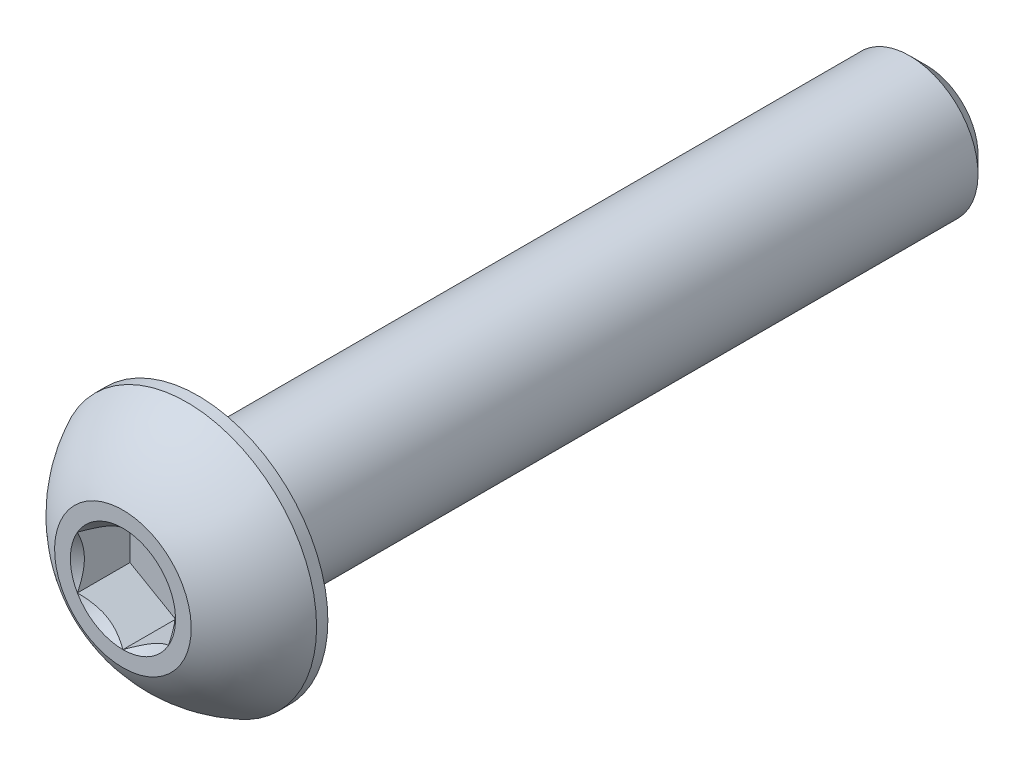
ISO-10303-21;
HEADER;
FILE_DESCRIPTION(('STEP AP214'),'2;1');
FILE_NAME('part.step','',(''),(''),'','','');
FILE_SCHEMA(('AUTOMOTIVE_DESIGN { 1 0 10303 214 1 1 1 1 }'));
ENDSEC;
DATA;
#1=APPLICATION_CONTEXT('core data for automotive mechanical design processes');
#2=APPLICATION_PROTOCOL_DEFINITION('international standard','automotive_design',2000,#1);
#3=PRODUCT_CONTEXT('',#1,'mechanical');
#4=PRODUCT('Part','Part','',(#3));
#5=PRODUCT_RELATED_PRODUCT_CATEGORY('part','',(#4));
#6=PRODUCT_DEFINITION_FORMATION('','',#4);
#7=PRODUCT_DEFINITION_CONTEXT('part definition',#1,'design');
#8=PRODUCT_DEFINITION('design','',#6,#7);
#9=PRODUCT_DEFINITION_SHAPE('','',#8);
#10=(LENGTH_UNIT() NAMED_UNIT(*) SI_UNIT(.MILLI.,.METRE.));
#11=(NAMED_UNIT(*) PLANE_ANGLE_UNIT() SI_UNIT($,.RADIAN.));
#12=(NAMED_UNIT(*) SI_UNIT($,.STERADIAN.) SOLID_ANGLE_UNIT());
#13=UNCERTAINTY_MEASURE_WITH_UNIT(LENGTH_MEASURE(1.E-05),#10,'distance_accuracy_value','');
#14=(GEOMETRIC_REPRESENTATION_CONTEXT(3) GLOBAL_UNCERTAINTY_ASSIGNED_CONTEXT((#13)) GLOBAL_UNIT_ASSIGNED_CONTEXT((#10,
#11,#12)) REPRESENTATION_CONTEXT('',''));
#15=CARTESIAN_POINT('',(0.,0.,0.));
#16=DIRECTION('',(0.,0.,1.));
#17=DIRECTION('',(1.,0.,0.));
#18=AXIS2_PLACEMENT_3D('',#15,#16,#17);
#19=CARTESIAN_POINT('',(0.,-1.5,-17.65));
#20=DIRECTION('',(0.,0.,-1.));
#21=DIRECTION('',(0.,1.,0.));
#22=AXIS2_PLACEMENT_3D('',#19,#20,#21);
#23=PLANE('',#22);
#24=CARTESIAN_POINT('',(0.,0.,-17.65));
#25=DIRECTION('',(0.,0.,-1.));
#26=DIRECTION('',(0.,1.,0.));
#27=AXIS2_PLACEMENT_3D('',#24,#25,#26);
#28=CIRCLE('',#27,1.125);
#29=CARTESIAN_POINT('',(0.,1.125,-17.65));
#30=VERTEX_POINT('',#29);
#31=EDGE_CURVE('E174',#30,#30,#28,.T.);
#32=ORIENTED_EDGE('',*,*,#31,.T.);
#33=EDGE_LOOP('',(#32));
#34=FACE_BOUND('',#33,.T.);
#35=ADVANCED_FACE('F34',(#34),#23,.T.);
#36=CARTESIAN_POINT('',(0.,0.,-17.65));
#37=DIRECTION('',(0.,0.,-1.));
#38=DIRECTION('',(0.,1.,0.));
#39=AXIS2_PLACEMENT_3D('',#36,#37,#38);
#40=CYLINDRICAL_SURFACE('',#39,1.5);
#41=CARTESIAN_POINT('',(0.,0.,-17.275));
#42=DIRECTION('',(0.,0.,-1.));
#43=DIRECTION('',(0.,1.,0.));
#44=AXIS2_PLACEMENT_3D('',#41,#42,#43);
#45=CIRCLE('',#44,1.5);
#46=CARTESIAN_POINT('',(0.,1.5,-17.275));
#47=VERTEX_POINT('',#46);
#48=EDGE_CURVE('E48',#47,#47,#45,.F.);
#49=ORIENTED_EDGE('',*,*,#48,.T.);
#50=EDGE_LOOP('',(#49));
#51=FACE_BOUND('',#50,.T.);
#52=CARTESIAN_POINT('',(0.,0.,-1.65));
#53=DIRECTION('',(0.,0.,1.));
#54=DIRECTION('',(1.,0.,0.));
#55=AXIS2_PLACEMENT_3D('',#52,#53,#54);
#56=CIRCLE('',#55,1.5);
#57=CARTESIAN_POINT('',(1.5,0.,-1.65));
#58=VERTEX_POINT('',#57);
#59=EDGE_CURVE('E171',#58,#58,#56,.F.);
#60=ORIENTED_EDGE('',*,*,#59,.T.);
#61=EDGE_LOOP('',(#60));
#62=FACE_BOUND('',#61,.T.);
#63=ADVANCED_FACE('F179',(#51,#62),#40,.T.);
#64=CARTESIAN_POINT('',(0.,0.,-17.65));
#65=DIRECTION('',(0.,0.,1.));
#66=DIRECTION('',(0.,-1.,0.));
#67=AXIS2_PLACEMENT_3D('',#64,#65,#66);
#68=CONICAL_SURFACE('',#67,1.125,0.785398163397447);
#69=ORIENTED_EDGE('',*,*,#48,.F.);
#70=EDGE_LOOP('',(#69));
#71=FACE_BOUND('',#70,.T.);
#72=ORIENTED_EDGE('',*,*,#31,.F.);
#73=EDGE_LOOP('',(#72));
#74=FACE_BOUND('',#73,.T.);
#75=ADVANCED_FACE('F36',(#71,#74),#68,.T.);
#76=CARTESIAN_POINT('',(0.,0.,-2.79483288770053));
#77=DIRECTION('',(0.,0.,1.));
#78=DIRECTION('',(0.,-1.,0.));
#79=AXIS2_PLACEMENT_3D('',#76,#77,#78);
#80=SPHERICAL_SURFACE('',#79,3.17192226735973);
#81=CARTESIAN_POINT('',(0.,0.,0.));
#82=DIRECTION('',(0.,0.,1.));
#83=DIRECTION('',(1.,0.,0.));
#84=AXIS2_PLACEMENT_3D('',#81,#82,#83);
#85=CIRCLE('',#84,1.5);
#86=CARTESIAN_POINT('',(0.,-1.5,0.));
#87=VERTEX_POINT('',#86);
#88=EDGE_CURVE('E168',#87,#87,#85,.T.);
#89=CARTESIAN_POINT('',(0.,0.,-1.4025));
#90=DIRECTION('',(0.,0.,1.));
#91=DIRECTION('',(1.,0.,0.));
#92=AXIS2_PLACEMENT_3D('',#89,#90,#91);
#93=CIRCLE('',#92,2.85);
#94=CARTESIAN_POINT('',(0.,-2.85,-1.4025));
#95=VERTEX_POINT('',#94);
#96=EDGE_CURVE('E162',#95,#95,#93,.T.);
#97=CARTESIAN_POINT('',(0.,-1.5,0.));
#98=CARTESIAN_POINT('',(0.,-1.5181600798921,-0.00974656947336525));
#99=CARTESIAN_POINT('',(0.,-1.53622513742981,-0.0196701847238475));
#100=CARTESIAN_POINT('',(0.,-1.57215840256594,-0.0398676311293121));
#101=CARTESIAN_POINT('',(0.,-1.59002661016438,-0.0501414622842944));
#102=CARTESIAN_POINT('',(0.,-1.6255593701915,-0.0710354648490241));
#103=CARTESIAN_POINT('',(0.,-1.64322392262019,-0.0816556362587714));
#104=CARTESIAN_POINT('',(0.,-1.67834266450262,-0.103238276426967));
#105=CARTESIAN_POINT('',(0.,-1.69579685395636,-0.114200745185416));
#106=CARTESIAN_POINT('',(0.,-1.73048823664554,-0.136463816635606));
#107=CARTESIAN_POINT('',(0.,-1.74772542988099,-0.147764419327347));
#108=CARTESIAN_POINT('',(0.,-1.78197627078176,-0.170699464187153));
#109=CARTESIAN_POINT('',(0.,-1.79898991844709,-0.182333906355219));
#110=CARTESIAN_POINT('',(0.,-1.83278720341135,-0.205932209546912));
#111=CARTESIAN_POINT('',(0.,-1.84957084071028,-0.21789607057054));
#112=CARTESIAN_POINT('',(0.,-1.88290172764636,-0.242148665498754));
#113=CARTESIAN_POINT('',(0.,-1.8994489772835,-0.254437399403341));
#114=CARTESIAN_POINT('',(0.,-1.93230080139369,-0.279335070725423));
#115=CARTESIAN_POINT('',(0.,-1.94860537586673,-0.291944008142919));
#116=CARTESIAN_POINT('',(0.,-1.98096565436365,-0.317477295441111));
#117=CARTESIAN_POINT('',(0.,-1.99702135838753,-0.330401645321806));
#118=CARTESIAN_POINT('',(0.,-2.02887779526296,-0.356560846652225));
#119=CARTESIAN_POINT('',(0.,-2.04467852811452,-0.369795698101948));
#120=CARTESIAN_POINT('',(0.,-2.07601901880464,-0.396570873693307));
#121=CARTESIAN_POINT('',(0.,-2.09155877664321,-0.410111197834943));
#122=CARTESIAN_POINT('',(0.,-2.12237141262985,-0.437492173862105));
#123=CARTESIAN_POINT('',(0.,-2.13764429077792,-0.451332825747633));
#124=CARTESIAN_POINT('',(0.,-2.16791736411296,-0.479309198198267));
#125=CARTESIAN_POINT('',(0.,-2.18291755929993,-0.493444918763374));
#126=CARTESIAN_POINT('',(0.,-2.21263956705415,-0.52200605739095));
#127=CARTESIAN_POINT('',(0.,-2.22736137962139,-0.536431475453418));
#128=CARTESIAN_POINT('',(0.,-2.2565210282552,-0.56556652781647));
#129=CARTESIAN_POINT('',(0.,-2.27095886432177,-0.580276162117054));
#130=CARTESIAN_POINT('',(0.,-2.2995450739765,-0.609974057702794));
#131=CARTESIAN_POINT('',(0.,-2.31369344756465,-0.624962318987951));
#132=CARTESIAN_POINT('',(0.,-2.34169535627252,-0.655211773418758));
#133=CARTESIAN_POINT('',(0.,-2.35554889139223,-0.670472966564409));
#134=CARTESIAN_POINT('',(0.,-2.38295585920366,-0.701262485885582));
#135=CARTESIAN_POINT('',(0.,-2.39650929189537,-0.716790812061104));
#136=CARTESIAN_POINT('',(0.,-2.42331090492182,-0.748108697108241));
#137=CARTESIAN_POINT('',(0.,-2.43655908525656,-0.763898255979857));
#138=CARTESIAN_POINT('',(0.,-2.46274515962755,-0.795732606824226));
#139=CARTESIAN_POINT('',(0.,-2.47568305366379,-0.811777398796979));
#140=CARTESIAN_POINT('',(0.,-2.50124363939651,-0.844116119267125));
#141=CARTESIAN_POINT('',(0.,-2.51386633109298,-0.860410047764518));
#142=CARTESIAN_POINT('',(0.,-2.53879171587278,-0.893240850042598));
#143=CARTESIAN_POINT('',(0.,-2.55109440895612,-0.909777723823285));
#144=CARTESIAN_POINT('',(0.,-2.57537512182785,-0.943088133113638));
#145=CARTESIAN_POINT('',(0.,-2.58735314161625,-0.959861668623304));
#146=CARTESIAN_POINT('',(0.,-2.61097995657956,-0.993639027894246));
#147=CARTESIAN_POINT('',(0.,-2.62262875175448,-1.01064285165552));
#148=CARTESIAN_POINT('',(0.,-2.64559269128199,-1.04487432644225));
#149=CARTESIAN_POINT('',(0.,-2.65690783563458,-1.06210197746771));
#150=CARTESIAN_POINT('',(0.,-2.67920017403639,-1.09677456077299));
#151=CARTESIAN_POINT('',(0.,-2.69017736808561,-1.11421949305282));
#152=CARTESIAN_POINT('',(0.,-2.711789634999,-1.14932001019995));
#153=CARTESIAN_POINT('',(0.,-2.72242470786316,-1.16697559506725));
#154=CARTESIAN_POINT('',(0.,-2.74334869082118,-1.20249070903943));
#155=CARTESIAN_POINT('',(0.,-2.75363760091502,-1.22035023814429));
#156=CARTESIAN_POINT('',(0.,-2.77386535089241,-1.25626645340824));
#157=CARTESIAN_POINT('',(0.,-2.78380419077596,-1.27432313956732));
#158=CARTESIAN_POINT('',(0.,-2.80332801615778,-1.31062681184411));
#159=CARTESIAN_POINT('',(0.,-2.81291300165605,-1.32887379796182));
#160=CARTESIAN_POINT('',(0.,-2.83172550494215,-1.3655511220839));
#161=CARTESIAN_POINT('',(0.,-2.84095302272998,-1.38398146008827));
#162=CARTESIAN_POINT('',(0.,-2.85,-1.4025));
#163=B_SPLINE_CURVE_WITH_KNOTS('',3,(#97,#98,#99,#100,#101,#102,#103,#104,#105,#106,#107,#108,
#109,#110,#111,#112,#113,#114,#115,#116,#117,#118,#119,#120,#121,#122,#123,#124,#125,#126,#127,
#128,#129,#130,#131,#132,#133,#134,#135,#136,#137,#138,#139,#140,#141,#142,#143,#144,#145,#146,
#147,#148,#149,#150,#151,#152,#153,#154,#155,#156,#157,#158,#159,#160,#161,#162),.UNSPECIFIED.,
.F.,.F.,(4,2,2,2,2,2,2,2,2,2,2,2,2,2,2,2,2,2,2,2,2,2,2,2,2,2,2,2,2,2,2,2,4),(0.,
0.0618298941826981,0.123659788365397,0.185489682548095,0.247319576730793,0.309149470913491,
0.37097936509619,0.432809259278888,0.494639153461585,0.556469047644284,0.618298941826982,
0.680128836009681,0.741958730192379,0.803788624375077,0.865618518557775,0.927448412740473,
0.989278306923172,1.05110820110587,1.11293809528857,1.17476798947127,1.23659788365396,
1.29842777783666,1.36025767201936,1.42208756620206,1.48391746038476,1.54574735456746,
1.60757724875015,1.66940714293285,1.73123703711555,1.79306693129825,1.85489682548095,
1.91672671966364,1.97855661384634),.UNSPECIFIED.);
#164=EDGE_CURVE('BSEAM184',#87,#95,#163,.T.);
#165=ORIENTED_EDGE('',*,*,#88,.F.);
#166=ORIENTED_EDGE('',*,*,#96,.T.);
#167=ORIENTED_EDGE('',*,*,#164,.T.);
#168=ORIENTED_EDGE('',*,*,#164,.F.);
#169=EDGE_LOOP('',(#165,#167,#166,#168));
#170=FACE_BOUND('',#169,.T.);
#171=ADVANCED_FACE('F184',(#170),#80,.T.);
#172=CARTESIAN_POINT('',(0.,-1.5,0.));
#173=DIRECTION('',(0.,0.,-1.));
#174=DIRECTION('',(-1.,0.,0.));
#175=AXIS2_PLACEMENT_3D('',#172,#173,#174);
#176=PLANE('',#175);
#177=CARTESIAN_POINT('',(0.,0.,0.));
#178=DIRECTION('',(0.,0.,1.));
#179=DIRECTION('',(1.,0.,0.));
#180=AXIS2_PLACEMENT_3D('',#177,#178,#179);
#181=CIRCLE('',#180,1.15470053837925);
#182=CARTESIAN_POINT('',(-1.,0.577350269189626,0.));
#183=VERTEX_POINT('',#182);
#184=CARTESIAN_POINT('',(-1.,-0.577350269189626,0.));
#185=VERTEX_POINT('',#184);
#186=EDGE_CURVE('E61',#183,#185,#181,.T.);
#187=ORIENTED_EDGE('',*,*,#186,.F.);
#188=CARTESIAN_POINT('',(0.,1.15470053837925,0.));
#189=VERTEX_POINT('',#188);
#190=EDGE_CURVE('E133',#189,#183,#181,.T.);
#191=ORIENTED_EDGE('',*,*,#190,.F.);
#192=CARTESIAN_POINT('',(1.,0.577350269189626,0.));
#193=VERTEX_POINT('',#192);
#194=EDGE_CURVE('E130',#193,#189,#181,.T.);
#195=ORIENTED_EDGE('',*,*,#194,.F.);
#196=CARTESIAN_POINT('',(1.,-0.577350269189626,0.));
#197=VERTEX_POINT('',#196);
#198=EDGE_CURVE('E101',#197,#193,#181,.T.);
#199=ORIENTED_EDGE('',*,*,#198,.F.);
#200=CARTESIAN_POINT('',(0.,-1.15470053837925,0.));
#201=VERTEX_POINT('',#200);
#202=EDGE_CURVE('E93',#201,#197,#181,.T.);
#203=ORIENTED_EDGE('',*,*,#202,.F.);
#204=EDGE_CURVE('E54',#185,#201,#181,.T.);
#205=ORIENTED_EDGE('',*,*,#204,.F.);
#206=EDGE_LOOP('',(#187,#191,#195,#199,#203,#205));
#207=FACE_BOUND('',#206,.T.);
#208=ORIENTED_EDGE('',*,*,#88,.T.);
#209=EDGE_LOOP('',(#208));
#210=FACE_BOUND('',#209,.T.);
#211=ADVANCED_FACE('F127',(#207,#210),#176,.F.);
#212=CARTESIAN_POINT('',(0.,-2.85,-1.65));
#213=DIRECTION('',(0.,0.,1.));
#214=DIRECTION('',(1.,0.,0.));
#215=AXIS2_PLACEMENT_3D('',#212,#213,#214);
#216=PLANE('',#215);
#217=ORIENTED_EDGE('',*,*,#59,.F.);
#218=EDGE_LOOP('',(#217));
#219=FACE_BOUND('',#218,.T.);
#220=CARTESIAN_POINT('',(0.,0.,-1.65));
#221=DIRECTION('',(0.,0.,1.));
#222=DIRECTION('',(1.,0.,0.));
#223=AXIS2_PLACEMENT_3D('',#220,#221,#222);
#224=CIRCLE('',#223,2.85);
#225=CARTESIAN_POINT('',(2.85,0.,-1.65));
#226=VERTEX_POINT('',#225);
#227=EDGE_CURVE('E165',#226,#226,#224,.T.);
#228=ORIENTED_EDGE('',*,*,#227,.F.);
#229=EDGE_LOOP('',(#228));
#230=FACE_BOUND('',#229,.T.);
#231=ADVANCED_FACE('F198',(#219,#230),#216,.F.);
#232=CARTESIAN_POINT('',(0.,0.,0.));
#233=DIRECTION('',(0.,0.,1.));
#234=DIRECTION('',(1.,0.,0.));
#235=AXIS2_PLACEMENT_3D('',#232,#233,#234);
#236=CYLINDRICAL_SURFACE('',#235,2.85);
#237=ORIENTED_EDGE('',*,*,#96,.F.);
#238=EDGE_LOOP('',(#237));
#239=FACE_BOUND('',#238,.T.);
#240=ORIENTED_EDGE('',*,*,#227,.T.);
#241=EDGE_LOOP('',(#240));
#242=FACE_BOUND('',#241,.T.);
#243=ADVANCED_FACE('F201',(#239,#242),#236,.T.);
#244=CARTESIAN_POINT('',(0.,0.,0.));
#245=DIRECTION('',(0.,0.,1.));
#246=DIRECTION('',(1.,0.,0.));
#247=AXIS2_PLACEMENT_3D('',#244,#245,#246);
#248=CONICAL_SURFACE('',#247,1.15470053837925,0.78539816339745);
#249=ORIENTED_EDGE('',*,*,#198,.T.);
#250=CARTESIAN_POINT('',(1.,-1.15147208646462,0.370385677513861));
#251=CARTESIAN_POINT('',(1.,-1.12343447988552,0.349219919873711));
#252=CARTESIAN_POINT('',(1.,-1.09524064850697,0.328261692175909));
#253=CARTESIAN_POINT('',(1.,-1.03847715644376,0.286846022235621));
#254=CARTESIAN_POINT('',(1.,-1.00990740382975,0.266388706123658));
#255=CARTESIAN_POINT('',(1.,-0.923120894333476,0.205604794954508));
#256=CARTESIAN_POINT('',(1.,-0.864253173759059,0.166192228961397));
#257=CARTESIAN_POINT('',(1.,-0.740809858258045,0.0888206642002044));
#258=CARTESIAN_POINT('',(1.,-0.676100255137807,0.0510730391143415));
#259=CARTESIAN_POINT('',(1.,-0.543448939049124,-0.0179754124487089));
#260=CARTESIAN_POINT('',(1.,-0.475519112027778,-0.0492979721531352));
#261=CARTESIAN_POINT('',(1.,-0.373555850333528,-0.0876182211162057));
#262=CARTESIAN_POINT('',(1.,-0.341031989670907,-0.0986164083578442));
#263=CARTESIAN_POINT('',(1.,-0.275199079052293,-0.11800165785264));
#264=CARTESIAN_POINT('',(1.,-0.241889975173933,-0.126388540223301));
#265=CARTESIAN_POINT('',(1.,-0.175247517042992,-0.139974779280984));
#266=CARTESIAN_POINT('',(1.,-0.141925568218175,-0.145229209232033));
#267=CARTESIAN_POINT('',(1.,-0.0749144362322788,-0.152451313429108));
#268=CARTESIAN_POINT('',(1.,-0.0412251978501616,-0.154418486389493));
#269=CARTESIAN_POINT('',(1.,0.0249580992634212,-0.15491680160684));
#270=CARTESIAN_POINT('',(1.,0.0574512826460396,-0.153569732111366));
#271=CARTESIAN_POINT('',(1.,0.122148505701867,-0.147783515501016));
#272=CARTESIAN_POINT('',(1.,0.154352610132927,-0.143345079338465));
#273=CARTESIAN_POINT('',(1.,0.21879989886764,-0.131543169854797));
#274=CARTESIAN_POINT('',(1.,0.251033743268954,-0.124129458961491));
#275=CARTESIAN_POINT('',(1.,0.314797132354919,-0.106771057501325));
#276=CARTESIAN_POINT('',(1.,0.346326735731005,-0.0968265787111708));
#277=CARTESIAN_POINT('',(1.,0.445594187730205,-0.0617765174456637));
#278=CARTESIAN_POINT('',(1.,0.511919139476036,-0.0326791416432759));
#279=CARTESIAN_POINT('',(1.,0.641453244657532,0.0320153296865042));
#280=CARTESIAN_POINT('',(1.,0.704650133126344,0.0676357767152411));
#281=CARTESIAN_POINT('',(1.,0.825428490174987,0.141123901346935));
#282=CARTESIAN_POINT('',(1.,0.883132947867685,0.178791947135463));
#283=CARTESIAN_POINT('',(1.,0.968148853704565,0.237022852943162));
#284=CARTESIAN_POINT('',(1.,0.996120570380285,0.256638475762856));
#285=CARTESIAN_POINT('',(1.,1.05168177729901,0.29638851706127));
#286=CARTESIAN_POINT('',(1.,1.079271369977,0.316522792198831));
#287=CARTESIAN_POINT('',(1.,1.10670185346329,0.336872119072971));
#288=B_SPLINE_CURVE_WITH_KNOTS('',3,(#250,#251,#252,#253,#254,#255,#256,#257,#258,#259,#260,
#261,#262,#263,#264,#265,#266,#267,#268,#269,#270,#271,#272,#273,#274,#275,#276,#277,#278,#279,
#280,#281,#282,#283,#284,#285,#286,#287),.UNSPECIFIED.,.F.,.F.,(4,2,2,2,2,2,2,2,2,2,2,2,2,2,2,2,
2,2,4),(0.,0.105386459083291,0.210799187330124,0.423233611565469,0.647793540908503,
0.871580877738609,0.97449307418142,1.07741235827201,1.17846428203205,1.27953161415762,
1.3769408673961,1.47432772585408,1.57343322804293,1.67253043972851,1.88917353996827,
2.10660791038813,2.31323734249843,2.41572589232044,2.51818641476503),.UNSPECIFIED.);
#289=EDGE_CURVE('E11',#197,#193,#288,.T.);
#290=ORIENTED_EDGE('',*,*,#289,.F.);
#291=EDGE_LOOP('',(#249,#290));
#292=FACE_BOUND('',#291,.T.);
#293=ADVANCED_FACE('F105',(#292),#248,.F.);
#294=ORIENTED_EDGE('',*,*,#194,.T.);
#295=CARTESIAN_POINT('',(1.0002,0.577234799135788,0.000115487372614006));
#296=CARTESIAN_POINT('',(0.965817404992819,0.597085599618622,-0.0197220691742671));
#297=CARTESIAN_POINT('',(0.930859881860175,0.617268335009456,-0.0383949793611112));
#298=CARTESIAN_POINT('',(0.85957719704391,0.658423412276686,-0.0725852572768422));
#299=CARTESIAN_POINT('',(0.823245249471016,0.67939967198808,-0.0880835909765416));
#300=CARTESIAN_POINT('',(0.749983386196689,0.721697428470846,-0.114632692857735));
#301=CARTESIAN_POINT('',(0.713072148554586,0.743008141459637,-0.125750226003074));
#302=CARTESIAN_POINT('',(0.638437270689141,0.786098608286186,-0.142880134223818));
#303=CARTESIAN_POINT('',(0.600715911891364,0.807877044942281,-0.148905302533327));
#304=CARTESIAN_POINT('',(0.535707801582066,0.845409494928863,-0.154339445032506));
#305=CARTESIAN_POINT('',(0.508505628471828,0.861114676896602,-0.155143061683268));
#306=CARTESIAN_POINT('',(0.454153959330888,0.892494627706029,-0.153793300583113));
#307=CARTESIAN_POINT('',(0.427004476245124,0.908169389073954,-0.151639270452801));
#308=CARTESIAN_POINT('',(0.345943722673039,0.954969836969511,-0.140883027871529));
#309=CARTESIAN_POINT('',(0.292435859021572,0.985862616452447,-0.127985443584644));
#310=CARTESIAN_POINT('',(0.198523934856568,1.04008269114923,-0.0968592693978229));
#311=CARTESIAN_POINT('',(0.157679476328165,1.06366425027551,-0.0802622022981608));
#312=CARTESIAN_POINT('',(0.077590362618056,1.1099037216352,-0.0428750753147072));
#313=CARTESIAN_POINT('',(0.038340989129562,1.1325643579843,-0.0220986581825966));
#314=CARTESIAN_POINT('',(-0.000200000000000344,1.15481600843309,0.000115487372613974));
#315=B_SPLINE_CURVE_WITH_KNOTS('',3,(#295,#296,#297,#298,#299,#300,#301,#302,#303,#304,#305,
#306,#307,#308,#309,#310,#311,#312,#313,#314),.UNSPECIFIED.,.F.,.F.,(4,2,2,2,2,2,2,2,2,4),(0.,
0.133237676828559,0.26725222983449,0.3991370762693,0.530689603280769,0.624814864263847,
0.718960890149133,0.907306626112098,1.05710100361789,1.20641411519286),.UNSPECIFIED.);
#316=EDGE_CURVE('E132',#193,#189,#315,.T.);
#317=ORIENTED_EDGE('',*,*,#316,.F.);
#318=EDGE_LOOP('',(#294,#317));
#319=FACE_BOUND('',#318,.T.);
#320=ADVANCED_FACE('F286',(#319),#248,.F.);
#321=ORIENTED_EDGE('',*,*,#190,.T.);
#322=CARTESIAN_POINT('',(0.000199999999999536,1.15481600843309,0.000115487372613877));
#323=CARTESIAN_POINT('',(-0.0341825950071811,1.13496520795026,-0.0197220691742669));
#324=CARTESIAN_POINT('',(-0.0691401181398252,1.11478247255942,-0.038394979361111));
#325=CARTESIAN_POINT('',(-0.14042280295609,1.07362739529219,-0.0725852572768421));
#326=CARTESIAN_POINT('',(-0.176754750528984,1.0526511355808,-0.0880835909765415));
#327=CARTESIAN_POINT('',(-0.250016613803311,1.01035337909803,-0.114632692857735));
#328=CARTESIAN_POINT('',(-0.286927851445415,0.989042666109241,-0.125750226003074));
#329=CARTESIAN_POINT('',(-0.36156272931086,0.945952199282691,-0.142880134223818));
#330=CARTESIAN_POINT('',(-0.399284088108636,0.924173762626596,-0.148905302533327));
#331=CARTESIAN_POINT('',(-0.464292198417934,0.886641312640014,-0.154339445032506));
#332=CARTESIAN_POINT('',(-0.491494371528173,0.870936130672275,-0.155143061683268));
#333=CARTESIAN_POINT('',(-0.545846040669112,0.839556179862848,-0.153793300583113));
#334=CARTESIAN_POINT('',(-0.572995523754876,0.823881418494923,-0.151639270452801));
#335=CARTESIAN_POINT('',(-0.654056277326961,0.777080970599366,-0.140883027871529));
#336=CARTESIAN_POINT('',(-0.707564140978428,0.74618819111643,-0.127985443584644));
#337=CARTESIAN_POINT('',(-0.801476065143432,0.691968116419649,-0.0968592693978229));
#338=CARTESIAN_POINT('',(-0.842320523671834,0.668386557293371,-0.0802622022981608));
#339=CARTESIAN_POINT('',(-0.922409637381944,0.622147085933681,-0.0428750753147074));
#340=CARTESIAN_POINT('',(-0.961659010870438,0.599486449584575,-0.0220986581825969));
#341=CARTESIAN_POINT('',(-1.0002,0.577234799135788,0.000115487372613628));
#342=B_SPLINE_CURVE_WITH_KNOTS('',3,(#322,#323,#324,#325,#326,#327,#328,#329,#330,#331,#332,
#333,#334,#335,#336,#337,#338,#339,#340,#341),.UNSPECIFIED.,.F.,.F.,(4,2,2,2,2,2,2,2,2,4),(0.,
0.133237676828559,0.26725222983449,0.3991370762693,0.530689603280768,0.624814864263846,
0.718960890149133,0.907306626112098,1.05710100361789,1.20641411519286),.UNSPECIFIED.);
#343=EDGE_CURVE('E137',#189,#183,#342,.T.);
#344=ORIENTED_EDGE('',*,*,#343,.F.);
#345=EDGE_LOOP('',(#321,#344));
#346=FACE_BOUND('',#345,.T.);
#347=ADVANCED_FACE('F140',(#346),#248,.F.);
#348=ORIENTED_EDGE('',*,*,#186,.T.);
#349=CARTESIAN_POINT('',(-1.,-1.15147208646462,0.370385677513861));
#350=CARTESIAN_POINT('',(-1.,-1.12343447988552,0.349219919873711));
#351=CARTESIAN_POINT('',(-1.,-1.09524064850697,0.328261692175909));
#352=CARTESIAN_POINT('',(-1.,-1.03847715644376,0.286846022235621));
#353=CARTESIAN_POINT('',(-1.,-1.00990740382975,0.266388706123658));
#354=CARTESIAN_POINT('',(-1.,-0.923120894333476,0.205604794954509));
#355=CARTESIAN_POINT('',(-1.,-0.864253173759059,0.166192228961397));
#356=CARTESIAN_POINT('',(-1.,-0.740809858258045,0.0888206642002043));
#357=CARTESIAN_POINT('',(-1.,-0.676100255137807,0.0510730391143417));
#358=CARTESIAN_POINT('',(-1.,-0.543448939049124,-0.0179754124487087));
#359=CARTESIAN_POINT('',(-1.,-0.475519112027779,-0.0492979721531351));
#360=CARTESIAN_POINT('',(-1.,-0.373555850333529,-0.0876182211162056));
#361=CARTESIAN_POINT('',(-1.,-0.341031989670908,-0.0986164083578442));
#362=CARTESIAN_POINT('',(-1.,-0.275199079052293,-0.11800165785264));
#363=CARTESIAN_POINT('',(-1.,-0.241889975173933,-0.126388540223301));
#364=CARTESIAN_POINT('',(-1.,-0.175247517042993,-0.139974779280984));
#365=CARTESIAN_POINT('',(-1.,-0.141925568218175,-0.145229209232033));
#366=CARTESIAN_POINT('',(-1.,-0.0749144362322789,-0.152451313429108));
#367=CARTESIAN_POINT('',(-1.,-0.0412251978501616,-0.154418486389493));
#368=CARTESIAN_POINT('',(-1.,0.0249580992634211,-0.15491680160684));
#369=CARTESIAN_POINT('',(-1.,0.0574512826460394,-0.153569732111366));
#370=CARTESIAN_POINT('',(-1.,0.122148505701867,-0.147783515501016));
#371=CARTESIAN_POINT('',(-1.,0.154352610132926,-0.143345079338465));
#372=CARTESIAN_POINT('',(-1.,0.21879989886764,-0.131543169854797));
#373=CARTESIAN_POINT('',(-1.,0.251033743268954,-0.124129458961491));
#374=CARTESIAN_POINT('',(-1.,0.314797132354919,-0.106771057501325));
#375=CARTESIAN_POINT('',(-1.,0.346326735731004,-0.0968265787111709));
#376=CARTESIAN_POINT('',(-1.,0.445594187730205,-0.0617765174456641));
#377=CARTESIAN_POINT('',(-1.,0.511919139476036,-0.0326791416432763));
#378=CARTESIAN_POINT('',(-1.,0.641453244657532,0.0320153296865039));
#379=CARTESIAN_POINT('',(-1.,0.704650133126344,0.0676357767152408));
#380=CARTESIAN_POINT('',(-1.,0.825428490174986,0.141123901346934));
#381=CARTESIAN_POINT('',(-1.,0.883132947867684,0.178791947135462));
#382=CARTESIAN_POINT('',(-1.,0.968148853704565,0.237022852943162));
#383=CARTESIAN_POINT('',(-1.,0.996120570380285,0.256638475762855));
#384=CARTESIAN_POINT('',(-1.,1.05168177729901,0.29638851706127));
#385=CARTESIAN_POINT('',(-1.,1.079271369977,0.316522792198831));
#386=CARTESIAN_POINT('',(-1.,1.10670185346329,0.336872119072971));
#387=B_SPLINE_CURVE_WITH_KNOTS('',3,(#349,#350,#351,#352,#353,#354,#355,#356,#357,#358,#359,
#360,#361,#362,#363,#364,#365,#366,#367,#368,#369,#370,#371,#372,#373,#374,#375,#376,#377,#378,
#379,#380,#381,#382,#383,#384,#385,#386),.UNSPECIFIED.,.F.,.F.,(4,2,2,2,2,2,2,2,2,2,2,2,2,2,2,2,
2,2,4),(0.,0.105386459083291,0.210799187330125,0.423233611565469,0.647793540908503,
0.871580877738609,0.97449307418142,1.07741235827201,1.17846428203205,1.27953161415762,
1.3769408673961,1.47432772585408,1.57343322804293,1.67253043972851,1.88917353996827,
2.10660791038813,2.31323734249843,2.41572589232044,2.51818641476503),.UNSPECIFIED.);
#388=EDGE_CURVE('E144',#183,#185,#387,.F.);
#389=ORIENTED_EDGE('',*,*,#388,.F.);
#390=EDGE_LOOP('',(#348,#389));
#391=FACE_BOUND('',#390,.T.);
#392=ADVANCED_FACE('F280',(#391),#248,.F.);
#393=ORIENTED_EDGE('',*,*,#204,.T.);
#394=CARTESIAN_POINT('',(-1.0002,-0.577234799135788,0.000115487372614006));
#395=CARTESIAN_POINT('',(-0.965817404992819,-0.597085599618622,-0.0197220691742672));
#396=CARTESIAN_POINT('',(-0.930859881860175,-0.617268335009456,-0.0383949793611114));
#397=CARTESIAN_POINT('',(-0.85957719704391,-0.658423412276686,-0.0725852572768424));
#398=CARTESIAN_POINT('',(-0.823245249471016,-0.67939967198808,-0.0880835909765416));
#399=CARTESIAN_POINT('',(-0.749983386196688,-0.721697428470846,-0.114632692857735));
#400=CARTESIAN_POINT('',(-0.713072148554585,-0.743008141459637,-0.125750226003074));
#401=CARTESIAN_POINT('',(-0.638437270689141,-0.786098608286186,-0.142880134223818));
#402=CARTESIAN_POINT('',(-0.600715911891364,-0.807877044942281,-0.148905302533328));
#403=CARTESIAN_POINT('',(-0.535707801582066,-0.845409494928863,-0.154339445032506));
#404=CARTESIAN_POINT('',(-0.508505628471828,-0.861114676896602,-0.155143061683268));
#405=CARTESIAN_POINT('',(-0.454153959330888,-0.892494627706029,-0.153793300583113));
#406=CARTESIAN_POINT('',(-0.427004476245124,-0.908169389073954,-0.151639270452801));
#407=CARTESIAN_POINT('',(-0.34594372267304,-0.954969836969511,-0.140883027871529));
#408=CARTESIAN_POINT('',(-0.292435859021572,-0.985862616452447,-0.127985443584644));
#409=CARTESIAN_POINT('',(-0.198523934856568,-1.04008269114923,-0.0968592693978226));
#410=CARTESIAN_POINT('',(-0.157679476328165,-1.06366425027551,-0.0802622022981605));
#411=CARTESIAN_POINT('',(-0.0775903626180561,-1.1099037216352,-0.0428750753147072));
#412=CARTESIAN_POINT('',(-0.0383409891295621,-1.1325643579843,-0.0220986581825966));
#413=CARTESIAN_POINT('',(0.000200000000000129,-1.15481600843309,0.000115487372614058));
#414=B_SPLINE_CURVE_WITH_KNOTS('',3,(#394,#395,#396,#397,#398,#399,#400,#401,#402,#403,#404,
#405,#406,#407,#408,#409,#410,#411,#412,#413),.UNSPECIFIED.,.F.,.F.,(4,2,2,2,2,2,2,2,2,4),(0.,
0.133237676828559,0.267252229834491,0.399137076269301,0.530689603280769,0.624814864263846,
0.718960890149133,0.907306626112098,1.05710100361789,1.20641411519286),.UNSPECIFIED.);
#415=EDGE_CURVE('E117',#185,#201,#414,.T.);
#416=ORIENTED_EDGE('',*,*,#415,.F.);
#417=EDGE_LOOP('',(#393,#416));
#418=FACE_BOUND('',#417,.T.);
#419=ADVANCED_FACE('F228',(#418),#248,.F.);
#420=ORIENTED_EDGE('',*,*,#202,.T.);
#421=CARTESIAN_POINT('',(-0.000199999999999763,-1.15481600843309,0.000115487372614094));
#422=CARTESIAN_POINT('',(0.0341825950071808,-1.13496520795026,-0.0197220691742669));
#423=CARTESIAN_POINT('',(0.069140118139825,-1.11478247255942,-0.0383949793611111));
#424=CARTESIAN_POINT('',(0.14042280295609,-1.07362739529219,-0.072585257276842));
#425=CARTESIAN_POINT('',(0.176754750528984,-1.0526511355808,-0.0880835909765413));
#426=CARTESIAN_POINT('',(0.250016613803311,-1.01035337909803,-0.114632692857735));
#427=CARTESIAN_POINT('',(0.286927851445414,-0.989042666109241,-0.125750226003074));
#428=CARTESIAN_POINT('',(0.361562729310859,-0.945952199282691,-0.142880134223818));
#429=CARTESIAN_POINT('',(0.399284088108636,-0.924173762626596,-0.148905302533327));
#430=CARTESIAN_POINT('',(0.464292198417934,-0.886641312640015,-0.154339445032506));
#431=CARTESIAN_POINT('',(0.491494371528172,-0.870936130672276,-0.155143061683268));
#432=CARTESIAN_POINT('',(0.545846040669112,-0.839556179862848,-0.153793300583113));
#433=CARTESIAN_POINT('',(0.572995523754876,-0.823881418494924,-0.151639270452801));
#434=CARTESIAN_POINT('',(0.65405627732696,-0.777080970599367,-0.140883027871529));
#435=CARTESIAN_POINT('',(0.707564140978427,-0.74618819111643,-0.127985443584644));
#436=CARTESIAN_POINT('',(0.801476065143431,-0.691968116419649,-0.0968592693978229));
#437=CARTESIAN_POINT('',(0.842320523671834,-0.668386557293371,-0.0802622022981608));
#438=CARTESIAN_POINT('',(0.922409637381944,-0.622147085933681,-0.0428750753147075));
#439=CARTESIAN_POINT('',(0.961659010870438,-0.599486449584575,-0.022098658182597));
#440=CARTESIAN_POINT('',(1.0002,-0.577234799135788,0.000115487372613757));
#441=B_SPLINE_CURVE_WITH_KNOTS('',3,(#421,#422,#423,#424,#425,#426,#427,#428,#429,#430,#431,
#432,#433,#434,#435,#436,#437,#438,#439,#440),.UNSPECIFIED.,.F.,.F.,(4,2,2,2,2,2,2,2,2,4),(0.,
0.133237676828559,0.26725222983449,0.3991370762693,0.530689603280768,0.624814864263846,
0.718960890149133,0.907306626112097,1.05710100361789,1.20641411519286),.UNSPECIFIED.);
#442=EDGE_CURVE('E97',#201,#197,#441,.T.);
#443=ORIENTED_EDGE('',*,*,#442,.F.);
#444=EDGE_LOOP('',(#420,#443));
#445=FACE_BOUND('',#444,.T.);
#446=ADVANCED_FACE('F95',(#445),#248,.F.);
#447=CARTESIAN_POINT('',(1.,-0.577350269189625,-1.155));
#448=DIRECTION('',(0.,0.,1.));
#449=DIRECTION('',(1.,0.,0.));
#450=AXIS2_PLACEMENT_3D('',#447,#448,#449);
#451=PLANE('',#450);
#452=DIRECTION('',(0.866025403784438,0.5,0.));
#453=VECTOR('',#452,1.);
#454=CARTESIAN_POINT('',(0.,-1.15470053837925,-1.155));
#455=LINE('',#454,#453);
#456=CARTESIAN_POINT('',(0.,-1.15470053837925,-1.155));
#457=VERTEX_POINT('',#456);
#458=CARTESIAN_POINT('',(1.,-0.577350269189626,-1.155));
#459=VERTEX_POINT('',#458);
#460=EDGE_CURVE('E116',#457,#459,#455,.T.);
#461=ORIENTED_EDGE('',*,*,#460,.T.);
#462=DIRECTION('',(0.,1.,0.));
#463=VECTOR('',#462,1.);
#464=CARTESIAN_POINT('',(1.,-0.577350269189626,-1.155));
#465=LINE('',#464,#463);
#466=CARTESIAN_POINT('',(1.,0.577350269189626,-1.155));
#467=VERTEX_POINT('',#466);
#468=EDGE_CURVE('E121',#459,#467,#465,.T.);
#469=ORIENTED_EDGE('',*,*,#468,.T.);
#470=DIRECTION('',(-0.866025403784439,0.5,0.));
#471=VECTOR('',#470,1.);
#472=CARTESIAN_POINT('',(1.,0.577350269189626,-1.155));
#473=LINE('',#472,#471);
#474=CARTESIAN_POINT('',(0.,1.15470053837925,-1.155));
#475=VERTEX_POINT('',#474);
#476=EDGE_CURVE('E270',#467,#475,#473,.T.);
#477=ORIENTED_EDGE('',*,*,#476,.T.);
#478=DIRECTION('',(-0.866025403784438,-0.5,0.));
#479=VECTOR('',#478,1.);
#480=CARTESIAN_POINT('',(0.,1.15470053837925,-1.155));
#481=LINE('',#480,#479);
#482=CARTESIAN_POINT('',(-1.,0.577350269189626,-1.155));
#483=VERTEX_POINT('',#482);
#484=EDGE_CURVE('E153',#475,#483,#481,.T.);
#485=ORIENTED_EDGE('',*,*,#484,.T.);
#486=DIRECTION('',(0.,-1.,0.));
#487=VECTOR('',#486,1.);
#488=CARTESIAN_POINT('',(-1.,0.577350269189626,-1.155));
#489=LINE('',#488,#487);
#490=CARTESIAN_POINT('',(-1.,-0.577350269189626,-1.155));
#491=VERTEX_POINT('',#490);
#492=EDGE_CURVE('E274',#483,#491,#489,.T.);
#493=ORIENTED_EDGE('',*,*,#492,.T.);
#494=DIRECTION('',(0.866025403784439,-0.5,0.));
#495=VECTOR('',#494,1.);
#496=CARTESIAN_POINT('',(-1.,-0.577350269189626,-1.155));
#497=LINE('',#496,#495);
#498=EDGE_CURVE('E124',#491,#457,#497,.T.);
#499=ORIENTED_EDGE('',*,*,#498,.T.);
#500=EDGE_LOOP('',(#461,#469,#477,#485,#493,#499));
#501=FACE_BOUND('',#500,.T.);
#502=ADVANCED_FACE('F227',(#501),#451,.T.);
#503=CARTESIAN_POINT('',(1.,-0.577350269189626,-1.155));
#504=DIRECTION('',(1.,0.,0.));
#505=DIRECTION('',(0.,0.,-1.));
#506=AXIS2_PLACEMENT_3D('',#503,#504,#505);
#507=PLANE('',#506);
#508=DIRECTION('',(0.,0.,1.));
#509=VECTOR('',#508,1.);
#510=CARTESIAN_POINT('',(1.,-0.577350269189626,-1.155));
#511=LINE('',#510,#509);
#512=EDGE_CURVE('E113',#459,#197,#511,.T.);
#513=ORIENTED_EDGE('',*,*,#512,.T.);
#514=ORIENTED_EDGE('',*,*,#289,.T.);
#515=DIRECTION('',(0.,0.,1.));
#516=VECTOR('',#515,1.);
#517=CARTESIAN_POINT('',(1.,0.577350269189626,-1.155));
#518=LINE('',#517,#516);
#519=EDGE_CURVE('E123',#467,#193,#518,.T.);
#520=ORIENTED_EDGE('',*,*,#519,.F.);
#521=ORIENTED_EDGE('',*,*,#468,.F.);
#522=EDGE_LOOP('',(#513,#514,#520,#521));
#523=FACE_BOUND('',#522,.T.);
#524=ADVANCED_FACE('F119',(#523),#507,.F.);
#525=CARTESIAN_POINT('',(1.,0.577350269189626,-1.155));
#526=DIRECTION('',(0.5,0.866025403784439,0.));
#527=DIRECTION('',(-0.866025403784439,0.5,0.));
#528=AXIS2_PLACEMENT_3D('',#525,#526,#527);
#529=PLANE('',#528);
#530=ORIENTED_EDGE('',*,*,#519,.T.);
#531=ORIENTED_EDGE('',*,*,#316,.T.);
#532=DIRECTION('',(0.,0.,1.));
#533=VECTOR('',#532,1.);
#534=CARTESIAN_POINT('',(0.,1.15470053837925,-1.155));
#535=LINE('',#534,#533);
#536=EDGE_CURVE('E149',#475,#189,#535,.T.);
#537=ORIENTED_EDGE('',*,*,#536,.F.);
#538=ORIENTED_EDGE('',*,*,#476,.F.);
#539=EDGE_LOOP('',(#530,#531,#537,#538));
#540=FACE_BOUND('',#539,.T.);
#541=ADVANCED_FACE('F147',(#540),#529,.F.);
#542=CARTESIAN_POINT('',(0.,1.15470053837925,-1.155));
#543=DIRECTION('',(-0.5,0.866025403784438,0.));
#544=DIRECTION('',(-0.866025403784438,-0.5,0.));
#545=AXIS2_PLACEMENT_3D('',#542,#543,#544);
#546=PLANE('',#545);
#547=ORIENTED_EDGE('',*,*,#536,.T.);
#548=ORIENTED_EDGE('',*,*,#343,.T.);
#549=DIRECTION('',(0.,0.,1.));
#550=VECTOR('',#549,1.);
#551=CARTESIAN_POINT('',(-1.,0.577350269189626,-1.155));
#552=LINE('',#551,#550);
#553=EDGE_CURVE('E155',#483,#183,#552,.T.);
#554=ORIENTED_EDGE('',*,*,#553,.F.);
#555=ORIENTED_EDGE('',*,*,#484,.F.);
#556=EDGE_LOOP('',(#547,#548,#554,#555));
#557=FACE_BOUND('',#556,.T.);
#558=ADVANCED_FACE('F151',(#557),#546,.F.);
#559=CARTESIAN_POINT('',(-1.,0.577350269189626,-1.155));
#560=DIRECTION('',(-1.,0.,0.));
#561=DIRECTION('',(0.,0.,1.));
#562=AXIS2_PLACEMENT_3D('',#559,#560,#561);
#563=PLANE('',#562);
#564=ORIENTED_EDGE('',*,*,#553,.T.);
#565=ORIENTED_EDGE('',*,*,#388,.T.);
#566=DIRECTION('',(0.,0.,1.));
#567=VECTOR('',#566,1.);
#568=CARTESIAN_POINT('',(-1.,-0.577350269189626,-1.155));
#569=LINE('',#568,#567);
#570=EDGE_CURVE('E157',#491,#185,#569,.T.);
#571=ORIENTED_EDGE('',*,*,#570,.F.);
#572=ORIENTED_EDGE('',*,*,#492,.F.);
#573=EDGE_LOOP('',(#564,#565,#571,#572));
#574=FACE_BOUND('',#573,.T.);
#575=ADVANCED_FACE('F249',(#574),#563,.F.);
#576=CARTESIAN_POINT('',(-1.,-0.577350269189626,-1.155));
#577=DIRECTION('',(-0.5,-0.866025403784439,0.));
#578=DIRECTION('',(0.866025403784439,-0.5,0.));
#579=AXIS2_PLACEMENT_3D('',#576,#577,#578);
#580=PLANE('',#579);
#581=ORIENTED_EDGE('',*,*,#570,.T.);
#582=ORIENTED_EDGE('',*,*,#415,.T.);
#583=DIRECTION('',(0.,0.,1.));
#584=VECTOR('',#583,1.);
#585=CARTESIAN_POINT('',(0.,-1.15470053837925,-1.155));
#586=LINE('',#585,#584);
#587=EDGE_CURVE('E115',#457,#201,#586,.T.);
#588=ORIENTED_EDGE('',*,*,#587,.F.);
#589=ORIENTED_EDGE('',*,*,#498,.F.);
#590=EDGE_LOOP('',(#581,#582,#588,#589));
#591=FACE_BOUND('',#590,.T.);
#592=ADVANCED_FACE('F208',(#591),#580,.F.);
#593=CARTESIAN_POINT('',(0.,-1.15470053837925,-1.155));
#594=DIRECTION('',(0.5,-0.866025403784438,0.));
#595=DIRECTION('',(0.866025403784438,0.5,0.));
#596=AXIS2_PLACEMENT_3D('',#593,#594,#595);
#597=PLANE('',#596);
#598=ORIENTED_EDGE('',*,*,#587,.T.);
#599=ORIENTED_EDGE('',*,*,#442,.T.);
#600=ORIENTED_EDGE('',*,*,#512,.F.);
#601=ORIENTED_EDGE('',*,*,#460,.F.);
#602=EDGE_LOOP('',(#598,#599,#600,#601));
#603=FACE_BOUND('',#602,.T.);
#604=ADVANCED_FACE('F111',(#603),#597,.F.);
#605=CLOSED_SHELL('',(#35,#63,#75,#171,#211,#231,#243,#293,#320,#347,#392,#419,#446,#502,#524,
#541,#558,#575,#592,#604));
#606=MANIFOLD_SOLID_BREP('B2',#605);
#607=ADVANCED_BREP_SHAPE_REPRESENTATION('',(#18,#606),#14);
#608=SHAPE_DEFINITION_REPRESENTATION(#9,#607);
ENDSEC;
END-ISO-10303-21;
